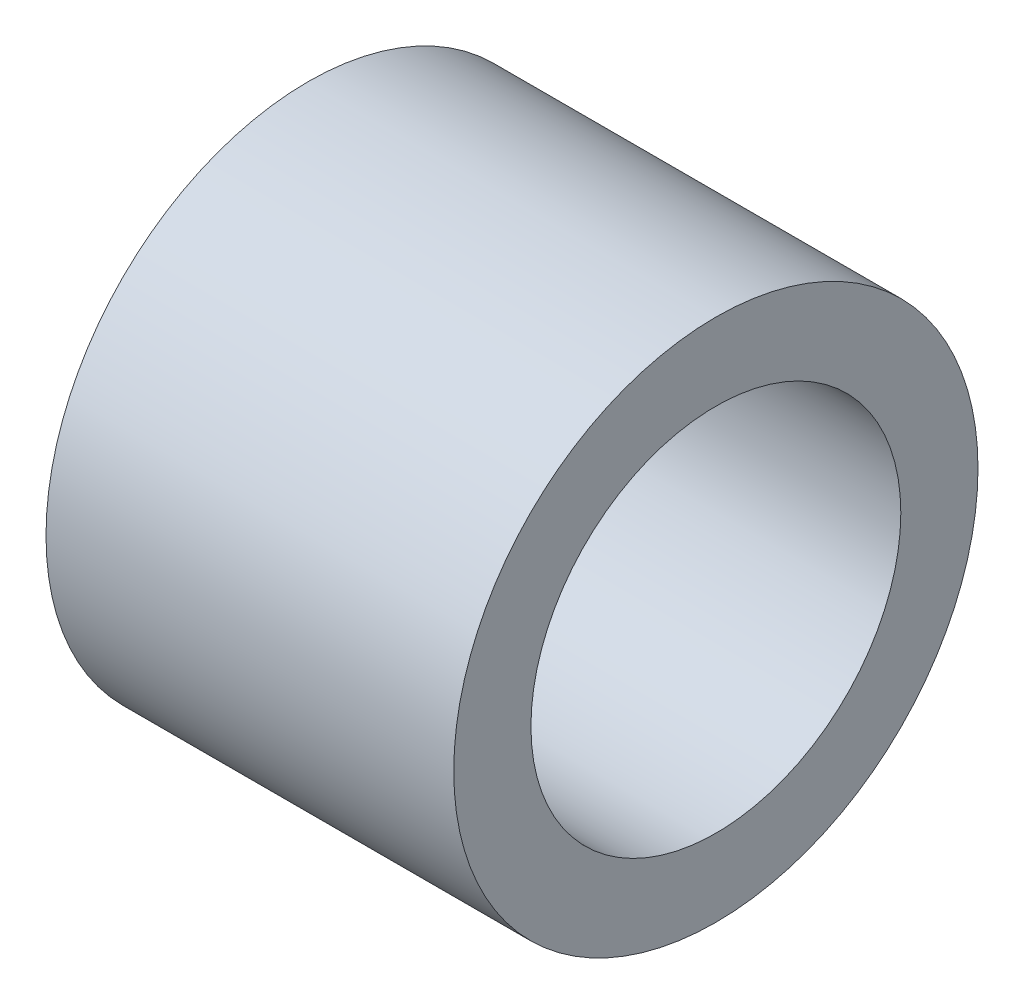
ISO-10303-21;
HEADER;
FILE_DESCRIPTION(('STEP AP214'),'2;1');
FILE_NAME('part.step','',(''),(''),'','','');
FILE_SCHEMA(('AUTOMOTIVE_DESIGN { 1 0 10303 214 1 1 1 1 }'));
ENDSEC;
DATA;
#1=APPLICATION_CONTEXT('core data for automotive mechanical design processes');
#2=APPLICATION_PROTOCOL_DEFINITION('international standard','automotive_design',2000,#1);
#3=PRODUCT_CONTEXT('',#1,'mechanical');
#4=PRODUCT('Part','Part','',(#3));
#5=PRODUCT_RELATED_PRODUCT_CATEGORY('part','',(#4));
#6=PRODUCT_DEFINITION_FORMATION('','',#4);
#7=PRODUCT_DEFINITION_CONTEXT('part definition',#1,'design');
#8=PRODUCT_DEFINITION('design','',#6,#7);
#9=PRODUCT_DEFINITION_SHAPE('','',#8);
#10=(LENGTH_UNIT() NAMED_UNIT(*) SI_UNIT(.MILLI.,.METRE.));
#11=(NAMED_UNIT(*) PLANE_ANGLE_UNIT() SI_UNIT($,.RADIAN.));
#12=(NAMED_UNIT(*) SI_UNIT($,.STERADIAN.) SOLID_ANGLE_UNIT());
#13=UNCERTAINTY_MEASURE_WITH_UNIT(LENGTH_MEASURE(1.E-05),#10,'distance_accuracy_value','');
#14=(GEOMETRIC_REPRESENTATION_CONTEXT(3) GLOBAL_UNCERTAINTY_ASSIGNED_CONTEXT((#13)) GLOBAL_UNIT_ASSIGNED_CONTEXT((#10,
#11,#12)) REPRESENTATION_CONTEXT('',''));
#15=CARTESIAN_POINT('',(0.,0.,0.));
#16=DIRECTION('',(0.,0.,1.));
#17=DIRECTION('',(1.,0.,0.));
#18=AXIS2_PLACEMENT_3D('',#15,#16,#17);
#19=CARTESIAN_POINT('',(97.,4.5,0.));
#20=DIRECTION('',(1.,0.,0.));
#21=DIRECTION('',(0.,0.,-1.));
#22=AXIS2_PLACEMENT_3D('',#19,#20,#21);
#23=PLANE('',#22);
#24=CARTESIAN_POINT('',(97.,0.,0.));
#25=DIRECTION('',(-1.,0.,0.));
#26=DIRECTION('',(0.,0.,1.));
#27=AXIS2_PLACEMENT_3D('',#24,#25,#26);
#28=CIRCLE('',#27,2.4);
#29=CARTESIAN_POINT('',(97.,0.,2.4));
#30=VERTEX_POINT('',#29);
#31=EDGE_CURVE('E10',#30,#30,#28,.T.);
#32=ORIENTED_EDGE('',*,*,#31,.F.);
#33=EDGE_LOOP('',(#32));
#34=FACE_BOUND('',#33,.T.);
#35=CARTESIAN_POINT('',(97.,0.,0.));
#36=DIRECTION('',(-1.,0.,0.));
#37=DIRECTION('',(0.,0.,1.));
#38=AXIS2_PLACEMENT_3D('',#35,#36,#37);
#39=CIRCLE('',#38,4.5);
#40=CARTESIAN_POINT('',(97.,0.,4.5));
#41=VERTEX_POINT('',#40);
#42=EDGE_CURVE('E53',#41,#41,#39,.T.);
#43=ORIENTED_EDGE('',*,*,#42,.T.);
#44=EDGE_LOOP('',(#43));
#45=FACE_BOUND('',#44,.T.);
#46=ADVANCED_FACE('F31',(#34,#45),#23,.F.);
#47=CARTESIAN_POINT('',(-110.,0.,0.));
#48=DIRECTION('',(-1.,0.,0.));
#49=DIRECTION('',(0.,0.,1.));
#50=AXIS2_PLACEMENT_3D('',#47,#48,#49);
#51=CYLINDRICAL_SURFACE('',#50,2.4);
#52=CARTESIAN_POINT('',(99.,0.,0.));
#53=DIRECTION('',(-1.,0.,0.));
#54=DIRECTION('',(0.,0.,1.));
#55=AXIS2_PLACEMENT_3D('',#52,#53,#54);
#56=CIRCLE('',#55,2.4);
#57=CARTESIAN_POINT('',(99.,0.,2.4));
#58=VERTEX_POINT('',#57);
#59=EDGE_CURVE('E37',#58,#58,#56,.T.);
#60=ORIENTED_EDGE('',*,*,#59,.F.);
#61=EDGE_LOOP('',(#60));
#62=FACE_BOUND('',#61,.T.);
#63=ORIENTED_EDGE('',*,*,#31,.T.);
#64=EDGE_LOOP('',(#63));
#65=FACE_BOUND('',#64,.T.);
#66=ADVANCED_FACE('F78',(#62,#65),#51,.F.);
#67=CARTESIAN_POINT('',(99.,2.4,0.));
#68=DIRECTION('',(-1.,0.,0.));
#69=DIRECTION('',(0.,0.,1.));
#70=AXIS2_PLACEMENT_3D('',#67,#68,#69);
#71=PLANE('',#70);
#72=CARTESIAN_POINT('',(99.,0.,0.));
#73=DIRECTION('',(-1.,0.,0.));
#74=DIRECTION('',(0.,0.,1.));
#75=AXIS2_PLACEMENT_3D('',#72,#73,#74);
#76=CIRCLE('',#75,3.175);
#77=CARTESIAN_POINT('',(99.,0.,3.175));
#78=VERTEX_POINT('',#77);
#79=EDGE_CURVE('E41',#78,#78,#76,.T.);
#80=ORIENTED_EDGE('',*,*,#79,.F.);
#81=EDGE_LOOP('',(#80));
#82=FACE_BOUND('',#81,.T.);
#83=ORIENTED_EDGE('',*,*,#59,.T.);
#84=EDGE_LOOP('',(#83));
#85=FACE_BOUND('',#84,.T.);
#86=ADVANCED_FACE('F73',(#82,#85),#71,.F.);
#87=CARTESIAN_POINT('',(-110.,0.,0.));
#88=DIRECTION('',(-1.,0.,0.));
#89=DIRECTION('',(0.,0.,1.));
#90=AXIS2_PLACEMENT_3D('',#87,#88,#89);
#91=CYLINDRICAL_SURFACE('',#90,3.175);
#92=CARTESIAN_POINT('',(104.,0.,0.));
#93=DIRECTION('',(-1.,0.,0.));
#94=DIRECTION('',(0.,0.,1.));
#95=AXIS2_PLACEMENT_3D('',#92,#93,#94);
#96=CIRCLE('',#95,3.175);
#97=CARTESIAN_POINT('',(104.,0.,3.175));
#98=VERTEX_POINT('',#97);
#99=EDGE_CURVE('E45',#98,#98,#96,.T.);
#100=ORIENTED_EDGE('',*,*,#99,.F.);
#101=EDGE_LOOP('',(#100));
#102=FACE_BOUND('',#101,.T.);
#103=ORIENTED_EDGE('',*,*,#79,.T.);
#104=EDGE_LOOP('',(#103));
#105=FACE_BOUND('',#104,.T.);
#106=ADVANCED_FACE('F67',(#102,#105),#91,.F.);
#107=CARTESIAN_POINT('',(104.,3.175,0.));
#108=DIRECTION('',(-1.,0.,0.));
#109=DIRECTION('',(0.,0.,1.));
#110=AXIS2_PLACEMENT_3D('',#107,#108,#109);
#111=PLANE('',#110);
#112=CARTESIAN_POINT('',(104.,0.,0.));
#113=DIRECTION('',(-1.,0.,0.));
#114=DIRECTION('',(0.,0.,1.));
#115=AXIS2_PLACEMENT_3D('',#112,#113,#114);
#116=CIRCLE('',#115,4.5);
#117=CARTESIAN_POINT('',(104.,0.,4.5));
#118=VERTEX_POINT('',#117);
#119=EDGE_CURVE('E50',#118,#118,#116,.T.);
#120=ORIENTED_EDGE('',*,*,#119,.F.);
#121=EDGE_LOOP('',(#120));
#122=FACE_BOUND('',#121,.T.);
#123=ORIENTED_EDGE('',*,*,#99,.T.);
#124=EDGE_LOOP('',(#123));
#125=FACE_BOUND('',#124,.T.);
#126=ADVANCED_FACE('F61',(#122,#125),#111,.F.);
#127=CARTESIAN_POINT('',(-110.,0.,0.));
#128=DIRECTION('',(-1.,0.,0.));
#129=DIRECTION('',(0.,0.,1.));
#130=AXIS2_PLACEMENT_3D('',#127,#128,#129);
#131=CYLINDRICAL_SURFACE('',#130,4.5);
#132=ORIENTED_EDGE('',*,*,#42,.F.);
#133=EDGE_LOOP('',(#132));
#134=FACE_BOUND('',#133,.T.);
#135=ORIENTED_EDGE('',*,*,#119,.T.);
#136=EDGE_LOOP('',(#135));
#137=FACE_BOUND('',#136,.T.);
#138=ADVANCED_FACE('F58',(#134,#137),#131,.T.);
#139=CLOSED_SHELL('',(#46,#66,#86,#106,#126,#138));
#140=MANIFOLD_SOLID_BREP('B2',#139);
#141=ADVANCED_BREP_SHAPE_REPRESENTATION('',(#18,#140),#14);
#142=SHAPE_DEFINITION_REPRESENTATION(#9,#141);
ENDSEC;
END-ISO-10303-21;
